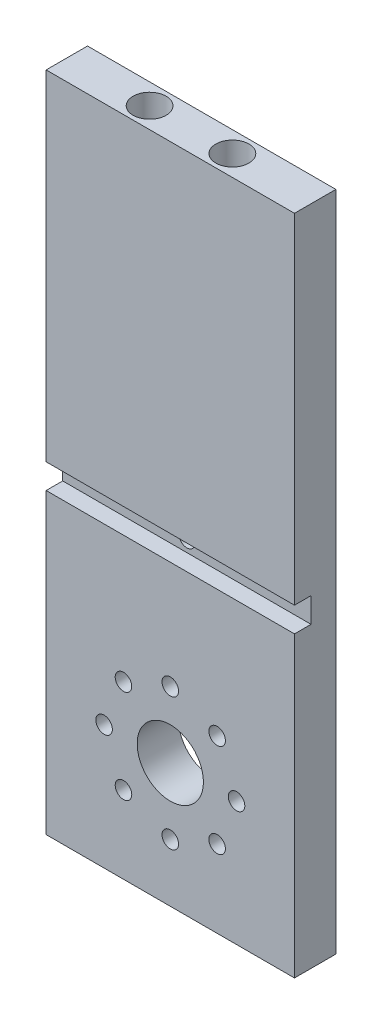
ISO-10303-21;
HEADER;
FILE_DESCRIPTION(('STEP AP214'),'2;1');
FILE_NAME('part.step','',(''),(''),'','','');
FILE_SCHEMA(('AUTOMOTIVE_DESIGN { 1 0 10303 214 1 1 1 1 }'));
ENDSEC;
DATA;
#1=APPLICATION_CONTEXT('core data for automotive mechanical design processes');
#2=APPLICATION_PROTOCOL_DEFINITION('international standard','automotive_design',2000,#1);
#3=PRODUCT_CONTEXT('',#1,'mechanical');
#4=PRODUCT('Part','Part','',(#3));
#5=PRODUCT_RELATED_PRODUCT_CATEGORY('part','',(#4));
#6=PRODUCT_DEFINITION_FORMATION('','',#4);
#7=PRODUCT_DEFINITION_CONTEXT('part definition',#1,'design');
#8=PRODUCT_DEFINITION('design','',#6,#7);
#9=PRODUCT_DEFINITION_SHAPE('','',#8);
#10=(LENGTH_UNIT() NAMED_UNIT(*) SI_UNIT(.MILLI.,.METRE.));
#11=(NAMED_UNIT(*) PLANE_ANGLE_UNIT() SI_UNIT($,.RADIAN.));
#12=(NAMED_UNIT(*) SI_UNIT($,.STERADIAN.) SOLID_ANGLE_UNIT());
#13=UNCERTAINTY_MEASURE_WITH_UNIT(LENGTH_MEASURE(1.E-05),#10,'distance_accuracy_value','');
#14=(GEOMETRIC_REPRESENTATION_CONTEXT(3) GLOBAL_UNCERTAINTY_ASSIGNED_CONTEXT((#13)) GLOBAL_UNIT_ASSIGNED_CONTEXT((#10,
#11,#12)) REPRESENTATION_CONTEXT('',''));
#15=CARTESIAN_POINT('',(0.,0.,0.));
#16=DIRECTION('',(0.,0.,1.));
#17=DIRECTION('',(1.,0.,0.));
#18=AXIS2_PLACEMENT_3D('',#15,#16,#17);
#19=CARTESIAN_POINT('',(-15.,80.,2.5));
#20=DIRECTION('',(0.,0.,-1.));
#21=DIRECTION('',(-1.,0.,0.));
#22=AXIS2_PLACEMENT_3D('',#19,#20,#21);
#23=PLANE('',#22);
#24=DIRECTION('',(0.,-1.,0.));
#25=VECTOR('',#24,1.);
#26=CARTESIAN_POINT('',(-15.,80.,2.5));
#27=LINE('',#26,#25);
#28=CARTESIAN_POINT('',(-15.,80.,2.5));
#29=VERTEX_POINT('',#28);
#30=CARTESIAN_POINT('',(-15.,39.,2.5));
#31=VERTEX_POINT('',#30);
#32=EDGE_CURVE('E11',#29,#31,#27,.T.);
#33=ORIENTED_EDGE('',*,*,#32,.T.);
#34=DIRECTION('',(-1.,0.,0.));
#35=VECTOR('',#34,1.);
#36=CARTESIAN_POINT('',(-15.,39.,2.5));
#37=LINE('',#36,#35);
#38=CARTESIAN_POINT('',(15.,39.,2.5));
#39=VERTEX_POINT('',#38);
#40=EDGE_CURVE('E124',#39,#31,#37,.T.);
#41=ORIENTED_EDGE('',*,*,#40,.F.);
#42=DIRECTION('',(0.,-1.,0.));
#43=VECTOR('',#42,1.);
#44=CARTESIAN_POINT('',(15.,80.,2.5));
#45=LINE('',#44,#43);
#46=CARTESIAN_POINT('',(15.,80.,2.5));
#47=VERTEX_POINT('',#46);
#48=EDGE_CURVE('E222',#47,#39,#45,.T.);
#49=ORIENTED_EDGE('',*,*,#48,.F.);
#50=DIRECTION('',(1.,0.,0.));
#51=VECTOR('',#50,1.);
#52=CARTESIAN_POINT('',(-15.,80.,2.5));
#53=LINE('',#52,#51);
#54=EDGE_CURVE('E87',#29,#47,#53,.T.);
#55=ORIENTED_EDGE('',*,*,#54,.F.);
#56=EDGE_LOOP('',(#33,#41,#49,#55));
#57=FACE_BOUND('',#56,.T.);
#58=ADVANCED_FACE('F37',(#57),#23,.F.);
#59=CARTESIAN_POINT('',(-15.,80.,-2.5));
#60=DIRECTION('',(1.,0.,0.));
#61=DIRECTION('',(0.,0.,-1.));
#62=AXIS2_PLACEMENT_3D('',#59,#60,#61);
#63=PLANE('',#62);
#64=DIRECTION('',(0.,-1.,0.));
#65=VECTOR('',#64,1.);
#66=CARTESIAN_POINT('',(-15.,39.,0.5));
#67=LINE('',#66,#65);
#68=CARTESIAN_POINT('',(-15.,39.,0.5));
#69=VERTEX_POINT('',#68);
#70=CARTESIAN_POINT('',(-15.,36.,0.5));
#71=VERTEX_POINT('',#70);
#72=EDGE_CURVE('E116',#69,#71,#67,.T.);
#73=ORIENTED_EDGE('',*,*,#72,.F.);
#74=DIRECTION('',(0.,0.,1.));
#75=VECTOR('',#74,1.);
#76=CARTESIAN_POINT('',(-15.,39.,0.5));
#77=LINE('',#76,#75);
#78=EDGE_CURVE('E158',#69,#31,#77,.T.);
#79=ORIENTED_EDGE('',*,*,#78,.T.);
#80=ORIENTED_EDGE('',*,*,#32,.F.);
#81=DIRECTION('',(0.,0.,1.));
#82=VECTOR('',#81,1.);
#83=CARTESIAN_POINT('',(-15.,80.,-2.5));
#84=LINE('',#83,#82);
#85=CARTESIAN_POINT('',(-15.,80.,-2.5));
#86=VERTEX_POINT('',#85);
#87=EDGE_CURVE('E201',#86,#29,#84,.T.);
#88=ORIENTED_EDGE('',*,*,#87,.F.);
#89=DIRECTION('',(0.,-1.,0.));
#90=VECTOR('',#89,1.);
#91=CARTESIAN_POINT('',(-15.,80.,-2.5));
#92=LINE('',#91,#90);
#93=CARTESIAN_POINT('',(-15.,0.,-2.5));
#94=VERTEX_POINT('',#93);
#95=EDGE_CURVE('E61',#86,#94,#92,.T.);
#96=ORIENTED_EDGE('',*,*,#95,.T.);
#97=DIRECTION('',(0.,0.,1.));
#98=VECTOR('',#97,1.);
#99=CARTESIAN_POINT('',(-15.,0.,-2.5));
#100=LINE('',#99,#98);
#101=CARTESIAN_POINT('',(-15.,0.,2.5));
#102=VERTEX_POINT('',#101);
#103=EDGE_CURVE('E192',#94,#102,#100,.T.);
#104=ORIENTED_EDGE('',*,*,#103,.T.);
#105=CARTESIAN_POINT('',(-15.,36.,2.5));
#106=VERTEX_POINT('',#105);
#107=EDGE_CURVE('E45',#106,#102,#27,.T.);
#108=ORIENTED_EDGE('',*,*,#107,.F.);
#109=DIRECTION('',(0.,0.,1.));
#110=VECTOR('',#109,1.);
#111=CARTESIAN_POINT('',(-15.,36.,0.5));
#112=LINE('',#111,#110);
#113=EDGE_CURVE('E110',#71,#106,#112,.T.);
#114=ORIENTED_EDGE('',*,*,#113,.F.);
#115=EDGE_LOOP('',(#73,#79,#80,#88,#96,#104,#108,#114));
#116=FACE_BOUND('',#115,.T.);
#117=ADVANCED_FACE('F39',(#116),#63,.F.);
#118=CARTESIAN_POINT('',(0.,23.,2.5));
#119=DIRECTION('',(0.,0.,1.));
#120=DIRECTION('',(1.,0.,0.));
#121=AXIS2_PLACEMENT_3D('',#118,#119,#120);
#122=CIRCLE('',#121,1.);
#123=CARTESIAN_POINT('',(1.,23.,2.5));
#124=VERTEX_POINT('',#123);
#125=EDGE_CURVE('E163',#124,#124,#122,.T.);
#126=ORIENTED_EDGE('',*,*,#125,.F.);
#127=EDGE_LOOP('',(#126));
#128=FACE_BOUND('',#127,.T.);
#129=CARTESIAN_POINT('',(5.65685424949238,20.6568542494924,2.5));
#130=DIRECTION('',(0.,0.,1.));
#131=DIRECTION('',(1.,0.,0.));
#132=AXIS2_PLACEMENT_3D('',#129,#130,#131);
#133=CIRCLE('',#132,0.999999999999934);
#134=CARTESIAN_POINT('',(6.65685424949231,20.6568542494924,2.5));
#135=VERTEX_POINT('',#134);
#136=EDGE_CURVE('E169',#135,#135,#133,.T.);
#137=ORIENTED_EDGE('',*,*,#136,.F.);
#138=EDGE_LOOP('',(#137));
#139=FACE_BOUND('',#138,.T.);
#140=CARTESIAN_POINT('',(8.,15.,2.5));
#141=DIRECTION('',(0.,0.,1.));
#142=DIRECTION('',(1.,0.,0.));
#143=AXIS2_PLACEMENT_3D('',#140,#141,#142);
#144=CIRCLE('',#143,1.);
#145=CARTESIAN_POINT('',(9.,15.,2.5));
#146=VERTEX_POINT('',#145);
#147=EDGE_CURVE('E175',#146,#146,#144,.T.);
#148=ORIENTED_EDGE('',*,*,#147,.F.);
#149=EDGE_LOOP('',(#148));
#150=FACE_BOUND('',#149,.T.);
#151=CARTESIAN_POINT('',(5.65685424949238,9.34314575050762,2.5));
#152=DIRECTION('',(0.,0.,1.));
#153=DIRECTION('',(1.,0.,0.));
#154=AXIS2_PLACEMENT_3D('',#151,#152,#153);
#155=CIRCLE('',#154,1.);
#156=CARTESIAN_POINT('',(6.65685424949238,9.34314575050762,2.5));
#157=VERTEX_POINT('',#156);
#158=EDGE_CURVE('E136',#157,#157,#155,.T.);
#159=ORIENTED_EDGE('',*,*,#158,.F.);
#160=EDGE_LOOP('',(#159));
#161=FACE_BOUND('',#160,.T.);
#162=CARTESIAN_POINT('',(0.,7.,2.5));
#163=DIRECTION('',(0.,0.,1.));
#164=DIRECTION('',(1.,0.,0.));
#165=AXIS2_PLACEMENT_3D('',#162,#163,#164);
#166=CIRCLE('',#165,1.);
#167=CARTESIAN_POINT('',(1.,7.,2.5));
#168=VERTEX_POINT('',#167);
#169=EDGE_CURVE('E137',#168,#168,#166,.T.);
#170=ORIENTED_EDGE('',*,*,#169,.F.);
#171=EDGE_LOOP('',(#170));
#172=FACE_BOUND('',#171,.T.);
#173=CARTESIAN_POINT('',(-5.65685424949238,9.34314575050761,2.5));
#174=DIRECTION('',(0.,0.,1.));
#175=DIRECTION('',(1.,0.,0.));
#176=AXIS2_PLACEMENT_3D('',#173,#174,#175);
#177=CIRCLE('',#176,1.);
#178=CARTESIAN_POINT('',(-4.65685424949238,9.34314575050761,2.5));
#179=VERTEX_POINT('',#178);
#180=EDGE_CURVE('E143',#179,#179,#177,.T.);
#181=ORIENTED_EDGE('',*,*,#180,.F.);
#182=EDGE_LOOP('',(#181));
#183=FACE_BOUND('',#182,.T.);
#184=CARTESIAN_POINT('',(-8.,15.,2.5));
#185=DIRECTION('',(0.,0.,1.));
#186=DIRECTION('',(1.,0.,0.));
#187=AXIS2_PLACEMENT_3D('',#184,#185,#186);
#188=CIRCLE('',#187,1.);
#189=CARTESIAN_POINT('',(-7.,15.,2.5));
#190=VERTEX_POINT('',#189);
#191=EDGE_CURVE('E149',#190,#190,#188,.T.);
#192=ORIENTED_EDGE('',*,*,#191,.F.);
#193=EDGE_LOOP('',(#192));
#194=FACE_BOUND('',#193,.T.);
#195=CARTESIAN_POINT('',(0.,15.,2.5));
#196=DIRECTION('',(0.,0.,1.));
#197=DIRECTION('',(1.,0.,0.));
#198=AXIS2_PLACEMENT_3D('',#195,#196,#197);
#199=CIRCLE('',#198,4.);
#200=CARTESIAN_POINT('',(4.,15.,2.5));
#201=VERTEX_POINT('',#200);
#202=EDGE_CURVE('E155',#201,#201,#199,.T.);
#203=ORIENTED_EDGE('',*,*,#202,.F.);
#204=EDGE_LOOP('',(#203));
#205=FACE_BOUND('',#204,.T.);
#206=CARTESIAN_POINT('',(-5.65685424949238,20.6568542494924,2.5));
#207=DIRECTION('',(0.,0.,1.));
#208=DIRECTION('',(1.,0.,0.));
#209=AXIS2_PLACEMENT_3D('',#206,#207,#208);
#210=CIRCLE('',#209,1.);
#211=CARTESIAN_POINT('',(-4.65685424949238,20.6568542494924,2.5));
#212=VERTEX_POINT('',#211);
#213=EDGE_CURVE('E162',#212,#212,#210,.T.);
#214=ORIENTED_EDGE('',*,*,#213,.F.);
#215=EDGE_LOOP('',(#214));
#216=FACE_BOUND('',#215,.T.);
#217=CARTESIAN_POINT('',(15.,36.,2.5));
#218=VERTEX_POINT('',#217);
#219=CARTESIAN_POINT('',(15.,0.,2.5));
#220=VERTEX_POINT('',#219);
#221=EDGE_CURVE('E221',#218,#220,#45,.T.);
#222=ORIENTED_EDGE('',*,*,#221,.F.);
#223=DIRECTION('',(1.,0.,0.));
#224=VECTOR('',#223,1.);
#225=CARTESIAN_POINT('',(-15.,36.,2.5));
#226=LINE('',#225,#224);
#227=EDGE_CURVE('E242',#106,#218,#226,.T.);
#228=ORIENTED_EDGE('',*,*,#227,.F.);
#229=ORIENTED_EDGE('',*,*,#107,.T.);
#230=DIRECTION('',(1.,0.,0.));
#231=VECTOR('',#230,1.);
#232=CARTESIAN_POINT('',(-15.,0.,2.5));
#233=LINE('',#232,#231);
#234=EDGE_CURVE('E211',#102,#220,#233,.T.);
#235=ORIENTED_EDGE('',*,*,#234,.T.);
#236=EDGE_LOOP('',(#222,#228,#229,#235));
#237=FACE_BOUND('',#236,.T.);
#238=ADVANCED_FACE('F231',(#128,#139,#150,#161,#172,#183,#194,#205,#216,#237),#23,.F.);
#239=CARTESIAN_POINT('',(15.,80.,-2.5));
#240=DIRECTION('',(1.,0.,0.));
#241=DIRECTION('',(0.,0.,-1.));
#242=AXIS2_PLACEMENT_3D('',#239,#240,#241);
#243=PLANE('',#242);
#244=DIRECTION('',(0.,0.,1.));
#245=VECTOR('',#244,1.);
#246=CARTESIAN_POINT('',(15.,39.,0.5));
#247=LINE('',#246,#245);
#248=CARTESIAN_POINT('',(15.,39.,0.5));
#249=VERTEX_POINT('',#248);
#250=EDGE_CURVE('E128',#249,#39,#247,.T.);
#251=ORIENTED_EDGE('',*,*,#250,.F.);
#252=DIRECTION('',(0.,1.,0.));
#253=VECTOR('',#252,1.);
#254=CARTESIAN_POINT('',(15.,39.,0.5));
#255=LINE('',#254,#253);
#256=CARTESIAN_POINT('',(15.,36.,0.5));
#257=VERTEX_POINT('',#256);
#258=EDGE_CURVE('E115',#257,#249,#255,.T.);
#259=ORIENTED_EDGE('',*,*,#258,.F.);
#260=DIRECTION('',(0.,0.,1.));
#261=VECTOR('',#260,1.);
#262=CARTESIAN_POINT('',(15.,36.,0.5));
#263=LINE('',#262,#261);
#264=EDGE_CURVE('E113',#257,#218,#263,.T.);
#265=ORIENTED_EDGE('',*,*,#264,.T.);
#266=ORIENTED_EDGE('',*,*,#221,.T.);
#267=DIRECTION('',(0.,0.,1.));
#268=VECTOR('',#267,1.);
#269=CARTESIAN_POINT('',(15.,0.,-2.5));
#270=LINE('',#269,#268);
#271=CARTESIAN_POINT('',(15.,0.,-2.5));
#272=VERTEX_POINT('',#271);
#273=EDGE_CURVE('E214',#272,#220,#270,.T.);
#274=ORIENTED_EDGE('',*,*,#273,.F.);
#275=DIRECTION('',(0.,-1.,0.));
#276=VECTOR('',#275,1.);
#277=CARTESIAN_POINT('',(15.,80.,-2.5));
#278=LINE('',#277,#276);
#279=CARTESIAN_POINT('',(15.,80.,-2.5));
#280=VERTEX_POINT('',#279);
#281=EDGE_CURVE('E220',#280,#272,#278,.T.);
#282=ORIENTED_EDGE('',*,*,#281,.F.);
#283=DIRECTION('',(0.,0.,1.));
#284=VECTOR('',#283,1.);
#285=CARTESIAN_POINT('',(15.,80.,-2.5));
#286=LINE('',#285,#284);
#287=EDGE_CURVE('E205',#280,#47,#286,.T.);
#288=ORIENTED_EDGE('',*,*,#287,.T.);
#289=ORIENTED_EDGE('',*,*,#48,.T.);
#290=EDGE_LOOP('',(#251,#259,#265,#266,#274,#282,#288,#289));
#291=FACE_BOUND('',#290,.T.);
#292=ADVANCED_FACE('F228',(#291),#243,.T.);
#293=CARTESIAN_POINT('',(-15.,80.,-2.5));
#294=DIRECTION('',(0.,0.,-1.));
#295=DIRECTION('',(-1.,0.,0.));
#296=AXIS2_PLACEMENT_3D('',#293,#294,#295);
#297=PLANE('',#296);
#298=CARTESIAN_POINT('',(0.,37.5,-2.5));
#299=DIRECTION('',(0.,0.,1.));
#300=DIRECTION('',(1.,0.,0.));
#301=AXIS2_PLACEMENT_3D('',#298,#299,#300);
#302=CIRCLE('',#301,1.);
#303=CARTESIAN_POINT('',(0.999999999999999,37.5,-2.5));
#304=VERTEX_POINT('',#303);
#305=EDGE_CURVE('E244',#304,#304,#302,.T.);
#306=ORIENTED_EDGE('',*,*,#305,.T.);
#307=EDGE_LOOP('',(#306));
#308=FACE_BOUND('',#307,.T.);
#309=CARTESIAN_POINT('',(0.,23.,-2.5));
#310=DIRECTION('',(0.,0.,1.));
#311=DIRECTION('',(1.,0.,0.));
#312=AXIS2_PLACEMENT_3D('',#309,#310,#311);
#313=CIRCLE('',#312,1.);
#314=CARTESIAN_POINT('',(1.,23.,-2.5));
#315=VERTEX_POINT('',#314);
#316=EDGE_CURVE('E159',#315,#315,#313,.T.);
#317=ORIENTED_EDGE('',*,*,#316,.T.);
#318=EDGE_LOOP('',(#317));
#319=FACE_BOUND('',#318,.T.);
#320=CARTESIAN_POINT('',(5.65685424949238,20.6568542494924,-2.5));
#321=DIRECTION('',(0.,0.,1.));
#322=DIRECTION('',(1.,0.,0.));
#323=AXIS2_PLACEMENT_3D('',#320,#321,#322);
#324=CIRCLE('',#323,0.999999999999934);
#325=CARTESIAN_POINT('',(6.65685424949231,20.6568542494924,-2.5));
#326=VERTEX_POINT('',#325);
#327=EDGE_CURVE('E166',#326,#326,#324,.T.);
#328=ORIENTED_EDGE('',*,*,#327,.T.);
#329=EDGE_LOOP('',(#328));
#330=FACE_BOUND('',#329,.T.);
#331=CARTESIAN_POINT('',(8.,15.,-2.5));
#332=DIRECTION('',(0.,0.,1.));
#333=DIRECTION('',(1.,0.,0.));
#334=AXIS2_PLACEMENT_3D('',#331,#332,#333);
#335=CIRCLE('',#334,1.);
#336=CARTESIAN_POINT('',(9.,15.,-2.5));
#337=VERTEX_POINT('',#336);
#338=EDGE_CURVE('E172',#337,#337,#335,.T.);
#339=ORIENTED_EDGE('',*,*,#338,.T.);
#340=EDGE_LOOP('',(#339));
#341=FACE_BOUND('',#340,.T.);
#342=CARTESIAN_POINT('',(5.65685424949238,9.34314575050762,-2.5));
#343=DIRECTION('',(0.,0.,1.));
#344=DIRECTION('',(1.,0.,0.));
#345=AXIS2_PLACEMENT_3D('',#342,#343,#344);
#346=CIRCLE('',#345,1.);
#347=CARTESIAN_POINT('',(6.65685424949238,9.34314575050762,-2.5));
#348=VERTEX_POINT('',#347);
#349=EDGE_CURVE('E178',#348,#348,#346,.T.);
#350=ORIENTED_EDGE('',*,*,#349,.T.);
#351=EDGE_LOOP('',(#350));
#352=FACE_BOUND('',#351,.T.);
#353=CARTESIAN_POINT('',(0.,7.,-2.5));
#354=DIRECTION('',(0.,0.,1.));
#355=DIRECTION('',(1.,0.,0.));
#356=AXIS2_PLACEMENT_3D('',#353,#354,#355);
#357=CIRCLE('',#356,1.);
#358=CARTESIAN_POINT('',(1.,7.,-2.5));
#359=VERTEX_POINT('',#358);
#360=EDGE_CURVE('E133',#359,#359,#357,.T.);
#361=ORIENTED_EDGE('',*,*,#360,.T.);
#362=EDGE_LOOP('',(#361));
#363=FACE_BOUND('',#362,.T.);
#364=CARTESIAN_POINT('',(-5.65685424949238,9.34314575050761,-2.5));
#365=DIRECTION('',(0.,0.,1.));
#366=DIRECTION('',(1.,0.,0.));
#367=AXIS2_PLACEMENT_3D('',#364,#365,#366);
#368=CIRCLE('',#367,1.);
#369=CARTESIAN_POINT('',(-4.65685424949238,9.34314575050761,-2.5));
#370=VERTEX_POINT('',#369);
#371=EDGE_CURVE('E140',#370,#370,#368,.T.);
#372=ORIENTED_EDGE('',*,*,#371,.T.);
#373=EDGE_LOOP('',(#372));
#374=FACE_BOUND('',#373,.T.);
#375=CARTESIAN_POINT('',(-8.,15.,-2.5));
#376=DIRECTION('',(0.,0.,1.));
#377=DIRECTION('',(1.,0.,0.));
#378=AXIS2_PLACEMENT_3D('',#375,#376,#377);
#379=CIRCLE('',#378,1.);
#380=CARTESIAN_POINT('',(-7.,15.,-2.5));
#381=VERTEX_POINT('',#380);
#382=EDGE_CURVE('E146',#381,#381,#379,.T.);
#383=ORIENTED_EDGE('',*,*,#382,.T.);
#384=EDGE_LOOP('',(#383));
#385=FACE_BOUND('',#384,.T.);
#386=CARTESIAN_POINT('',(0.,15.,-2.5));
#387=DIRECTION('',(0.,0.,1.));
#388=DIRECTION('',(1.,0.,0.));
#389=AXIS2_PLACEMENT_3D('',#386,#387,#388);
#390=CIRCLE('',#389,4.);
#391=CARTESIAN_POINT('',(4.,15.,-2.5));
#392=VERTEX_POINT('',#391);
#393=EDGE_CURVE('E152',#392,#392,#390,.T.);
#394=ORIENTED_EDGE('',*,*,#393,.T.);
#395=EDGE_LOOP('',(#394));
#396=FACE_BOUND('',#395,.T.);
#397=CARTESIAN_POINT('',(-5.65685424949238,20.6568542494924,-2.5));
#398=DIRECTION('',(0.,0.,1.));
#399=DIRECTION('',(1.,0.,0.));
#400=AXIS2_PLACEMENT_3D('',#397,#398,#399);
#401=CIRCLE('',#400,1.);
#402=CARTESIAN_POINT('',(-4.65685424949238,20.6568542494924,-2.5));
#403=VERTEX_POINT('',#402);
#404=EDGE_CURVE('E183',#403,#403,#401,.T.);
#405=ORIENTED_EDGE('',*,*,#404,.T.);
#406=EDGE_LOOP('',(#405));
#407=FACE_BOUND('',#406,.T.);
#408=DIRECTION('',(1.,0.,0.));
#409=VECTOR('',#408,1.);
#410=CARTESIAN_POINT('',(-15.,0.,-2.5));
#411=LINE('',#410,#409);
#412=EDGE_CURVE('E203',#94,#272,#411,.T.);
#413=ORIENTED_EDGE('',*,*,#412,.F.);
#414=ORIENTED_EDGE('',*,*,#95,.F.);
#415=DIRECTION('',(1.,0.,0.));
#416=VECTOR('',#415,1.);
#417=CARTESIAN_POINT('',(-15.,80.,-2.5));
#418=LINE('',#417,#416);
#419=EDGE_CURVE('E208',#86,#280,#418,.T.);
#420=ORIENTED_EDGE('',*,*,#419,.T.);
#421=ORIENTED_EDGE('',*,*,#281,.T.);
#422=EDGE_LOOP('',(#413,#414,#420,#421));
#423=FACE_BOUND('',#422,.T.);
#424=ADVANCED_FACE('F234',(#308,#319,#330,#341,#352,#363,#374,#385,#396,#407,#423),#297,.T.);
#425=CARTESIAN_POINT('',(0.,80.,0.));
#426=DIRECTION('',(0.,1.,0.));
#427=DIRECTION('',(0.,0.,1.));
#428=AXIS2_PLACEMENT_3D('',#425,#426,#427);
#429=PLANE('',#428);
#430=CARTESIAN_POINT('',(-5.,80.,0.));
#431=DIRECTION('',(0.,1.,0.));
#432=DIRECTION('',(0.,0.,1.));
#433=AXIS2_PLACEMENT_3D('',#430,#431,#432);
#434=CIRCLE('',#433,2.);
#435=CARTESIAN_POINT('',(-5.,80.,2.));
#436=VERTEX_POINT('',#435);
#437=EDGE_CURVE('E193',#436,#436,#434,.T.);
#438=ORIENTED_EDGE('',*,*,#437,.F.);
#439=EDGE_LOOP('',(#438));
#440=FACE_BOUND('',#439,.T.);
#441=CARTESIAN_POINT('',(5.,80.,0.));
#442=DIRECTION('',(0.,1.,0.));
#443=DIRECTION('',(0.,0.,1.));
#444=AXIS2_PLACEMENT_3D('',#441,#442,#443);
#445=CIRCLE('',#444,2.);
#446=CARTESIAN_POINT('',(5.,80.,2.));
#447=VERTEX_POINT('',#446);
#448=EDGE_CURVE('E186',#447,#447,#445,.T.);
#449=ORIENTED_EDGE('',*,*,#448,.F.);
#450=EDGE_LOOP('',(#449));
#451=FACE_BOUND('',#450,.T.);
#452=ORIENTED_EDGE('',*,*,#87,.T.);
#453=ORIENTED_EDGE('',*,*,#54,.T.);
#454=ORIENTED_EDGE('',*,*,#287,.F.);
#455=ORIENTED_EDGE('',*,*,#419,.F.);
#456=EDGE_LOOP('',(#452,#453,#454,#455));
#457=FACE_BOUND('',#456,.T.);
#458=ADVANCED_FACE('F238',(#440,#451,#457),#429,.T.);
#459=CARTESIAN_POINT('',(0.,0.,0.));
#460=DIRECTION('',(0.,1.,0.));
#461=DIRECTION('',(0.,0.,1.));
#462=AXIS2_PLACEMENT_3D('',#459,#460,#461);
#463=PLANE('',#462);
#464=ORIENTED_EDGE('',*,*,#103,.F.);
#465=ORIENTED_EDGE('',*,*,#412,.T.);
#466=ORIENTED_EDGE('',*,*,#273,.T.);
#467=ORIENTED_EDGE('',*,*,#234,.F.);
#468=EDGE_LOOP('',(#464,#465,#466,#467));
#469=FACE_BOUND('',#468,.T.);
#470=ADVANCED_FACE('F233',(#469),#463,.F.);
#471=CARTESIAN_POINT('',(5.,70.,0.));
#472=DIRECTION('',(0.,1.,0.));
#473=DIRECTION('',(0.,0.,1.));
#474=AXIS2_PLACEMENT_3D('',#471,#472,#473);
#475=CYLINDRICAL_SURFACE('',#474,2.);
#476=CARTESIAN_POINT('',(5.,70.,0.));
#477=DIRECTION('',(0.,1.,0.));
#478=DIRECTION('',(0.,0.,1.));
#479=AXIS2_PLACEMENT_3D('',#476,#477,#478);
#480=CIRCLE('',#479,2.);
#481=CARTESIAN_POINT('',(5.,70.,2.));
#482=VERTEX_POINT('',#481);
#483=EDGE_CURVE('E196',#482,#482,#480,.T.);
#484=ORIENTED_EDGE('',*,*,#483,.F.);
#485=EDGE_LOOP('',(#484));
#486=FACE_BOUND('',#485,.T.);
#487=ORIENTED_EDGE('',*,*,#448,.T.);
#488=EDGE_LOOP('',(#487));
#489=FACE_BOUND('',#488,.T.);
#490=ADVANCED_FACE('F327',(#486,#489),#475,.F.);
#491=CARTESIAN_POINT('',(5.,70.,0.));
#492=DIRECTION('',(0.,1.,0.));
#493=DIRECTION('',(0.,0.,1.));
#494=AXIS2_PLACEMENT_3D('',#491,#492,#493);
#495=PLANE('',#494);
#496=ORIENTED_EDGE('',*,*,#483,.T.);
#497=EDGE_LOOP('',(#496));
#498=FACE_BOUND('',#497,.T.);
#499=ADVANCED_FACE('F323',(#498),#495,.T.);
#500=CARTESIAN_POINT('',(-5.,70.,0.));
#501=DIRECTION('',(0.,1.,0.));
#502=DIRECTION('',(0.,0.,1.));
#503=AXIS2_PLACEMENT_3D('',#500,#501,#502);
#504=CYLINDRICAL_SURFACE('',#503,2.);
#505=CARTESIAN_POINT('',(-5.,70.,0.));
#506=DIRECTION('',(0.,1.,0.));
#507=DIRECTION('',(0.,0.,1.));
#508=AXIS2_PLACEMENT_3D('',#505,#506,#507);
#509=CIRCLE('',#508,2.);
#510=CARTESIAN_POINT('',(-5.,70.,2.));
#511=VERTEX_POINT('',#510);
#512=EDGE_CURVE('E189',#511,#511,#509,.T.);
#513=ORIENTED_EDGE('',*,*,#512,.F.);
#514=EDGE_LOOP('',(#513));
#515=FACE_BOUND('',#514,.T.);
#516=ORIENTED_EDGE('',*,*,#437,.T.);
#517=EDGE_LOOP('',(#516));
#518=FACE_BOUND('',#517,.T.);
#519=ADVANCED_FACE('F313',(#515,#518),#504,.F.);
#520=CARTESIAN_POINT('',(-5.,70.,0.));
#521=DIRECTION('',(0.,1.,0.));
#522=DIRECTION('',(0.,0.,1.));
#523=AXIS2_PLACEMENT_3D('',#520,#521,#522);
#524=PLANE('',#523);
#525=ORIENTED_EDGE('',*,*,#512,.T.);
#526=EDGE_LOOP('',(#525));
#527=FACE_BOUND('',#526,.T.);
#528=ADVANCED_FACE('F303',(#527),#524,.T.);
#529=CARTESIAN_POINT('',(-5.65685424949238,20.6568542494924,-2.5));
#530=DIRECTION('',(0.,0.,1.));
#531=DIRECTION('',(1.,0.,0.));
#532=AXIS2_PLACEMENT_3D('',#529,#530,#531);
#533=CYLINDRICAL_SURFACE('',#532,1.);
#534=ORIENTED_EDGE('',*,*,#404,.F.);
#535=EDGE_LOOP('',(#534));
#536=FACE_BOUND('',#535,.T.);
#537=ORIENTED_EDGE('',*,*,#213,.T.);
#538=EDGE_LOOP('',(#537));
#539=FACE_BOUND('',#538,.T.);
#540=ADVANCED_FACE('F300',(#536,#539),#533,.F.);
#541=CARTESIAN_POINT('',(0.,15.,-2.5));
#542=DIRECTION('',(0.,0.,1.));
#543=DIRECTION('',(1.,0.,0.));
#544=AXIS2_PLACEMENT_3D('',#541,#542,#543);
#545=CYLINDRICAL_SURFACE('',#544,4.);
#546=ORIENTED_EDGE('',*,*,#393,.F.);
#547=EDGE_LOOP('',(#546));
#548=FACE_BOUND('',#547,.T.);
#549=ORIENTED_EDGE('',*,*,#202,.T.);
#550=EDGE_LOOP('',(#549));
#551=FACE_BOUND('',#550,.T.);
#552=ADVANCED_FACE('F302',(#548,#551),#545,.F.);
#553=CARTESIAN_POINT('',(-8.,15.,-2.5));
#554=DIRECTION('',(0.,0.,1.));
#555=DIRECTION('',(1.,0.,0.));
#556=AXIS2_PLACEMENT_3D('',#553,#554,#555);
#557=CYLINDRICAL_SURFACE('',#556,1.);
#558=ORIENTED_EDGE('',*,*,#382,.F.);
#559=EDGE_LOOP('',(#558));
#560=FACE_BOUND('',#559,.T.);
#561=ORIENTED_EDGE('',*,*,#191,.T.);
#562=EDGE_LOOP('',(#561));
#563=FACE_BOUND('',#562,.T.);
#564=ADVANCED_FACE('F310',(#560,#563),#557,.F.);
#565=CARTESIAN_POINT('',(-5.65685424949238,9.34314575050761,-2.5));
#566=DIRECTION('',(0.,0.,1.));
#567=DIRECTION('',(1.,0.,0.));
#568=AXIS2_PLACEMENT_3D('',#565,#566,#567);
#569=CYLINDRICAL_SURFACE('',#568,1.);
#570=ORIENTED_EDGE('',*,*,#371,.F.);
#571=EDGE_LOOP('',(#570));
#572=FACE_BOUND('',#571,.T.);
#573=ORIENTED_EDGE('',*,*,#180,.T.);
#574=EDGE_LOOP('',(#573));
#575=FACE_BOUND('',#574,.T.);
#576=ADVANCED_FACE('F418',(#572,#575),#569,.F.);
#577=CARTESIAN_POINT('',(0.,7.,-2.5));
#578=DIRECTION('',(0.,0.,1.));
#579=DIRECTION('',(1.,0.,0.));
#580=AXIS2_PLACEMENT_3D('',#577,#578,#579);
#581=CYLINDRICAL_SURFACE('',#580,1.);
#582=ORIENTED_EDGE('',*,*,#360,.F.);
#583=EDGE_LOOP('',(#582));
#584=FACE_BOUND('',#583,.T.);
#585=ORIENTED_EDGE('',*,*,#169,.T.);
#586=EDGE_LOOP('',(#585));
#587=FACE_BOUND('',#586,.T.);
#588=ADVANCED_FACE('F409',(#584,#587),#581,.F.);
#589=CARTESIAN_POINT('',(5.65685424949238,9.34314575050762,-2.5));
#590=DIRECTION('',(0.,0.,1.));
#591=DIRECTION('',(1.,0.,0.));
#592=AXIS2_PLACEMENT_3D('',#589,#590,#591);
#593=CYLINDRICAL_SURFACE('',#592,1.);
#594=ORIENTED_EDGE('',*,*,#349,.F.);
#595=EDGE_LOOP('',(#594));
#596=FACE_BOUND('',#595,.T.);
#597=ORIENTED_EDGE('',*,*,#158,.T.);
#598=EDGE_LOOP('',(#597));
#599=FACE_BOUND('',#598,.T.);
#600=ADVANCED_FACE('F318',(#596,#599),#593,.F.);
#601=CARTESIAN_POINT('',(8.,15.,-2.5));
#602=DIRECTION('',(0.,0.,1.));
#603=DIRECTION('',(1.,0.,0.));
#604=AXIS2_PLACEMENT_3D('',#601,#602,#603);
#605=CYLINDRICAL_SURFACE('',#604,1.);
#606=ORIENTED_EDGE('',*,*,#338,.F.);
#607=EDGE_LOOP('',(#606));
#608=FACE_BOUND('',#607,.T.);
#609=ORIENTED_EDGE('',*,*,#147,.T.);
#610=EDGE_LOOP('',(#609));
#611=FACE_BOUND('',#610,.T.);
#612=ADVANCED_FACE('F391',(#608,#611),#605,.F.);
#613=CARTESIAN_POINT('',(5.65685424949238,20.6568542494924,-2.5));
#614=DIRECTION('',(0.,0.,1.));
#615=DIRECTION('',(1.,0.,0.));
#616=AXIS2_PLACEMENT_3D('',#613,#614,#615);
#617=CYLINDRICAL_SURFACE('',#616,0.999999999999934);
#618=ORIENTED_EDGE('',*,*,#327,.F.);
#619=EDGE_LOOP('',(#618));
#620=FACE_BOUND('',#619,.T.);
#621=ORIENTED_EDGE('',*,*,#136,.T.);
#622=EDGE_LOOP('',(#621));
#623=FACE_BOUND('',#622,.T.);
#624=ADVANCED_FACE('F382',(#620,#623),#617,.F.);
#625=CARTESIAN_POINT('',(0.,23.,-2.5));
#626=DIRECTION('',(0.,0.,1.));
#627=DIRECTION('',(1.,0.,0.));
#628=AXIS2_PLACEMENT_3D('',#625,#626,#627);
#629=CYLINDRICAL_SURFACE('',#628,1.);
#630=ORIENTED_EDGE('',*,*,#316,.F.);
#631=EDGE_LOOP('',(#630));
#632=FACE_BOUND('',#631,.T.);
#633=ORIENTED_EDGE('',*,*,#125,.T.);
#634=EDGE_LOOP('',(#633));
#635=FACE_BOUND('',#634,.T.);
#636=ADVANCED_FACE('F369',(#632,#635),#629,.F.);
#637=CARTESIAN_POINT('',(-15.,39.,0.5));
#638=DIRECTION('',(0.,1.,0.));
#639=DIRECTION('',(0.,0.,1.));
#640=AXIS2_PLACEMENT_3D('',#637,#638,#639);
#641=PLANE('',#640);
#642=ORIENTED_EDGE('',*,*,#40,.T.);
#643=ORIENTED_EDGE('',*,*,#78,.F.);
#644=DIRECTION('',(-1.,0.,0.));
#645=VECTOR('',#644,1.);
#646=CARTESIAN_POINT('',(-15.,39.,0.5));
#647=LINE('',#646,#645);
#648=EDGE_CURVE('E122',#249,#69,#647,.T.);
#649=ORIENTED_EDGE('',*,*,#648,.F.);
#650=ORIENTED_EDGE('',*,*,#250,.T.);
#651=EDGE_LOOP('',(#642,#643,#649,#650));
#652=FACE_BOUND('',#651,.T.);
#653=ADVANCED_FACE('F247',(#652),#641,.F.);
#654=CARTESIAN_POINT('',(-15.,36.,0.5));
#655=DIRECTION('',(0.,-1.,0.));
#656=DIRECTION('',(0.,0.,-1.));
#657=AXIS2_PLACEMENT_3D('',#654,#655,#656);
#658=PLANE('',#657);
#659=ORIENTED_EDGE('',*,*,#227,.T.);
#660=ORIENTED_EDGE('',*,*,#264,.F.);
#661=DIRECTION('',(1.,0.,0.));
#662=VECTOR('',#661,1.);
#663=CARTESIAN_POINT('',(-15.,36.,0.5));
#664=LINE('',#663,#662);
#665=EDGE_CURVE('E52',#71,#257,#664,.T.);
#666=ORIENTED_EDGE('',*,*,#665,.F.);
#667=ORIENTED_EDGE('',*,*,#113,.T.);
#668=EDGE_LOOP('',(#659,#660,#666,#667));
#669=FACE_BOUND('',#668,.T.);
#670=ADVANCED_FACE('F108',(#669),#658,.F.);
#671=CARTESIAN_POINT('',(0.,0.,0.5));
#672=DIRECTION('',(0.,0.,1.));
#673=DIRECTION('',(1.,0.,0.));
#674=AXIS2_PLACEMENT_3D('',#671,#672,#673);
#675=PLANE('',#674);
#676=CARTESIAN_POINT('',(0.,37.5,0.5));
#677=DIRECTION('',(0.,0.,1.));
#678=DIRECTION('',(1.,0.,0.));
#679=AXIS2_PLACEMENT_3D('',#676,#677,#678);
#680=CIRCLE('',#679,1.);
#681=CARTESIAN_POINT('',(0.999999999999999,37.5,0.5));
#682=VERTEX_POINT('',#681);
#683=EDGE_CURVE('E250',#682,#682,#680,.T.);
#684=ORIENTED_EDGE('',*,*,#683,.F.);
#685=EDGE_LOOP('',(#684));
#686=FACE_BOUND('',#685,.T.);
#687=ORIENTED_EDGE('',*,*,#72,.T.);
#688=ORIENTED_EDGE('',*,*,#665,.T.);
#689=ORIENTED_EDGE('',*,*,#258,.T.);
#690=ORIENTED_EDGE('',*,*,#648,.T.);
#691=EDGE_LOOP('',(#687,#688,#689,#690));
#692=FACE_BOUND('',#691,.T.);
#693=ADVANCED_FACE('F120',(#686,#692),#675,.T.);
#694=CARTESIAN_POINT('',(0.,37.5,-2.5));
#695=DIRECTION('',(0.,0.,1.));
#696=DIRECTION('',(1.,0.,0.));
#697=AXIS2_PLACEMENT_3D('',#694,#695,#696);
#698=CYLINDRICAL_SURFACE('',#697,1.);
#699=ORIENTED_EDGE('',*,*,#305,.F.);
#700=EDGE_LOOP('',(#699));
#701=FACE_BOUND('',#700,.T.);
#702=ORIENTED_EDGE('',*,*,#683,.T.);
#703=EDGE_LOOP('',(#702));
#704=FACE_BOUND('',#703,.T.);
#705=ADVANCED_FACE('F258',(#701,#704),#698,.F.);
#706=CLOSED_SHELL('',(#58,#117,#238,#292,#424,#458,#470,#490,#499,#519,#528,#540,#552,#564,#576,
#588,#600,#612,#624,#636,#653,#670,#693,#705));
#707=MANIFOLD_SOLID_BREP('B2',#706);
#708=ADVANCED_BREP_SHAPE_REPRESENTATION('',(#18,#707),#14);
#709=SHAPE_DEFINITION_REPRESENTATION(#9,#708);
ENDSEC;
END-ISO-10303-21;
